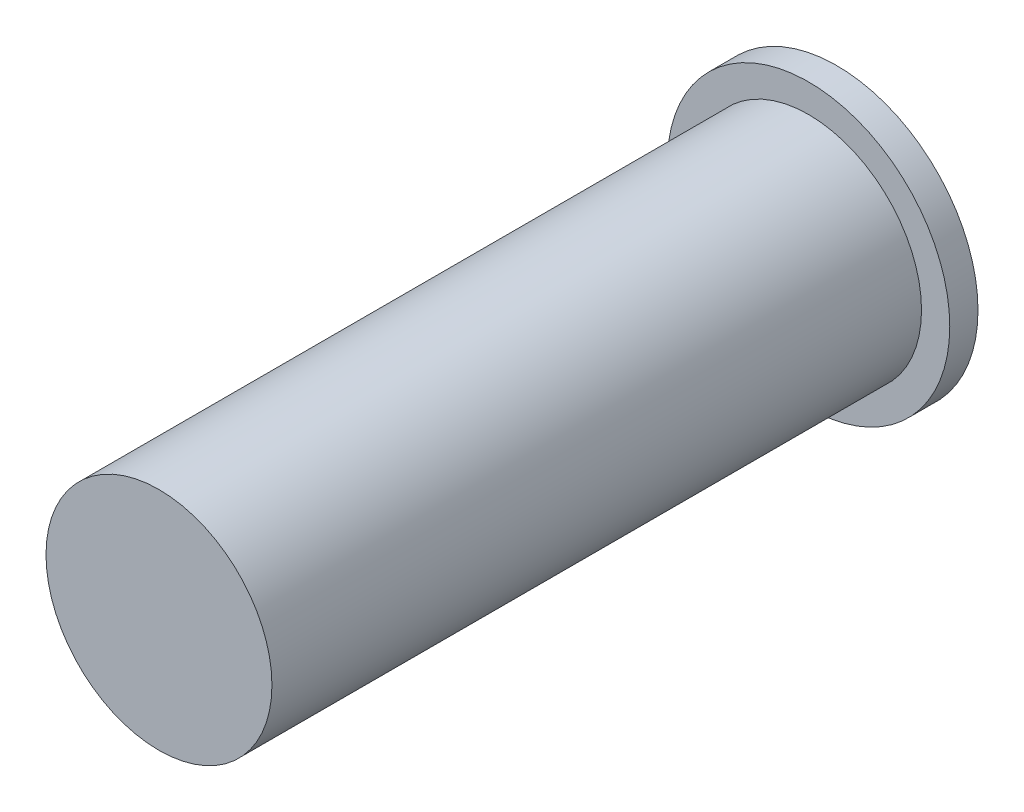
ISO-10303-21;
HEADER;
FILE_DESCRIPTION(('STEP AP214'),'2;1');
FILE_NAME('part.step','',(''),(''),'','','');
FILE_SCHEMA(('AUTOMOTIVE_DESIGN { 1 0 10303 214 1 1 1 1 }'));
ENDSEC;
DATA;
#1=APPLICATION_CONTEXT('core data for automotive mechanical design processes');
#2=APPLICATION_PROTOCOL_DEFINITION('international standard','automotive_design',2000,#1);
#3=PRODUCT_CONTEXT('',#1,'mechanical');
#4=PRODUCT('Part','Part','',(#3));
#5=PRODUCT_RELATED_PRODUCT_CATEGORY('part','',(#4));
#6=PRODUCT_DEFINITION_FORMATION('','',#4);
#7=PRODUCT_DEFINITION_CONTEXT('part definition',#1,'design');
#8=PRODUCT_DEFINITION('design','',#6,#7);
#9=PRODUCT_DEFINITION_SHAPE('','',#8);
#10=(LENGTH_UNIT() NAMED_UNIT(*) SI_UNIT(.MILLI.,.METRE.));
#11=(NAMED_UNIT(*) PLANE_ANGLE_UNIT() SI_UNIT($,.RADIAN.));
#12=(NAMED_UNIT(*) SI_UNIT($,.STERADIAN.) SOLID_ANGLE_UNIT());
#13=UNCERTAINTY_MEASURE_WITH_UNIT(LENGTH_MEASURE(1.E-05),#10,'distance_accuracy_value','');
#14=(GEOMETRIC_REPRESENTATION_CONTEXT(3) GLOBAL_UNCERTAINTY_ASSIGNED_CONTEXT((#13)) GLOBAL_UNIT_ASSIGNED_CONTEXT((#10,
#11,#12)) REPRESENTATION_CONTEXT('',''));
#15=CARTESIAN_POINT('',(0.,0.,0.));
#16=DIRECTION('',(0.,0.,1.));
#17=DIRECTION('',(1.,0.,0.));
#18=AXIS2_PLACEMENT_3D('',#15,#16,#17);
#19=CARTESIAN_POINT('',(-3.96875,0.,0.));
#20=DIRECTION('',(0.,0.,-1.));
#21=DIRECTION('',(-1.,0.,0.));
#22=AXIS2_PLACEMENT_3D('',#19,#20,#21);
#23=PLANE('',#22);
#24=CARTESIAN_POINT('',(0.,0.,0.));
#25=DIRECTION('',(0.,0.,1.));
#26=DIRECTION('',(1.,0.,0.));
#27=AXIS2_PLACEMENT_3D('',#24,#25,#26);
#28=CIRCLE('',#27,3.96875);
#29=CARTESIAN_POINT('',(3.96875,0.,0.));
#30=VERTEX_POINT('',#29);
#31=EDGE_CURVE('E17',#30,#30,#28,.T.);
#32=ORIENTED_EDGE('',*,*,#31,.F.);
#33=EDGE_LOOP('',(#32));
#34=FACE_BOUND('',#33,.T.);
#35=ADVANCED_FACE('F14',(#34),#23,.T.);
#36=CARTESIAN_POINT('',(0.,0.,54.));
#37=DIRECTION('',(0.,0.,1.));
#38=DIRECTION('',(1.,0.,0.));
#39=AXIS2_PLACEMENT_3D('',#36,#37,#38);
#40=CYLINDRICAL_SURFACE('',#39,3.96875);
#41=ORIENTED_EDGE('',*,*,#31,.T.);
#42=EDGE_LOOP('',(#41));
#43=FACE_BOUND('',#42,.T.);
#44=CARTESIAN_POINT('',(0.,0.,0.793750000000003));
#45=DIRECTION('',(0.,0.,1.));
#46=DIRECTION('',(1.,0.,0.));
#47=AXIS2_PLACEMENT_3D('',#44,#45,#46);
#48=CIRCLE('',#47,3.96875);
#49=CARTESIAN_POINT('',(3.96875,0.,0.793750000000003));
#50=VERTEX_POINT('',#49);
#51=EDGE_CURVE('E26',#50,#50,#48,.T.);
#52=ORIENTED_EDGE('',*,*,#51,.F.);
#53=EDGE_LOOP('',(#52));
#54=FACE_BOUND('',#53,.T.);
#55=ADVANCED_FACE('F34',(#43,#54),#40,.T.);
#56=CARTESIAN_POINT('',(-3.175,0.,19.05));
#57=DIRECTION('',(0.,0.,1.));
#58=DIRECTION('',(1.,0.,0.));
#59=AXIS2_PLACEMENT_3D('',#56,#57,#58);
#60=PLANE('',#59);
#61=CARTESIAN_POINT('',(0.,0.,19.05));
#62=DIRECTION('',(0.,0.,1.));
#63=DIRECTION('',(1.,0.,0.));
#64=AXIS2_PLACEMENT_3D('',#61,#62,#63);
#65=CIRCLE('',#64,3.175);
#66=CARTESIAN_POINT('',(3.175,0.,19.05));
#67=VERTEX_POINT('',#66);
#68=EDGE_CURVE('E21',#67,#67,#65,.F.);
#69=ORIENTED_EDGE('',*,*,#68,.F.);
#70=EDGE_LOOP('',(#69));
#71=FACE_BOUND('',#70,.T.);
#72=ADVANCED_FACE('F42',(#71),#60,.T.);
#73=CARTESIAN_POINT('',(-3.96875,0.,0.79375));
#74=DIRECTION('',(0.,0.,1.));
#75=DIRECTION('',(1.,0.,0.));
#76=AXIS2_PLACEMENT_3D('',#73,#74,#75);
#77=PLANE('',#76);
#78=ORIENTED_EDGE('',*,*,#51,.T.);
#79=EDGE_LOOP('',(#78));
#80=FACE_BOUND('',#79,.T.);
#81=CARTESIAN_POINT('',(0.,0.,0.793750000000003));
#82=DIRECTION('',(0.,0.,1.));
#83=DIRECTION('',(1.,0.,0.));
#84=AXIS2_PLACEMENT_3D('',#81,#82,#83);
#85=CIRCLE('',#84,3.175);
#86=CARTESIAN_POINT('',(3.175,0.,0.793750000000003));
#87=VERTEX_POINT('',#86);
#88=EDGE_CURVE('E10',#87,#87,#85,.T.);
#89=ORIENTED_EDGE('',*,*,#88,.F.);
#90=EDGE_LOOP('',(#89));
#91=FACE_BOUND('',#90,.T.);
#92=ADVANCED_FACE('F45',(#80,#91),#77,.T.);
#93=CARTESIAN_POINT('',(0.,0.,54.));
#94=DIRECTION('',(0.,0.,1.));
#95=DIRECTION('',(1.,0.,0.));
#96=AXIS2_PLACEMENT_3D('',#93,#94,#95);
#97=CYLINDRICAL_SURFACE('',#96,3.175);
#98=ORIENTED_EDGE('',*,*,#88,.T.);
#99=EDGE_LOOP('',(#98));
#100=FACE_BOUND('',#99,.T.);
#101=ORIENTED_EDGE('',*,*,#68,.T.);
#102=EDGE_LOOP('',(#101));
#103=FACE_BOUND('',#102,.T.);
#104=ADVANCED_FACE('F43',(#100,#103),#97,.T.);
#105=CLOSED_SHELL('',(#35,#55,#72,#92,#104));
#106=MANIFOLD_SOLID_BREP('B1',#105);
#107=ADVANCED_BREP_SHAPE_REPRESENTATION('',(#18,#106),#14);
#108=SHAPE_DEFINITION_REPRESENTATION(#9,#107);
ENDSEC;
END-ISO-10303-21;
